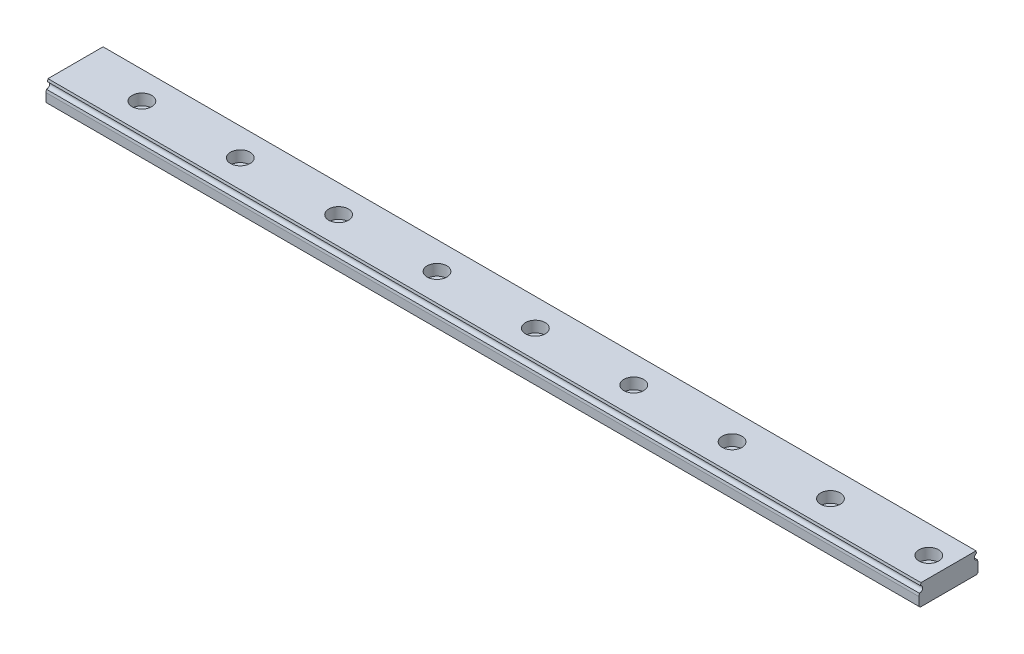
ISO-10303-21;
HEADER;
FILE_DESCRIPTION(('STEP AP214'),'2;1');
FILE_NAME('part.step','',(''),(''),'','','');
FILE_SCHEMA(('AUTOMOTIVE_DESIGN { 1 0 10303 214 1 1 1 1 }'));
ENDSEC;
DATA;
#1=APPLICATION_CONTEXT('core data for automotive mechanical design processes');
#2=APPLICATION_PROTOCOL_DEFINITION('international standard','automotive_design',2000,#1);
#3=PRODUCT_CONTEXT('',#1,'mechanical');
#4=PRODUCT('Part','Part','',(#3));
#5=PRODUCT_RELATED_PRODUCT_CATEGORY('part','',(#4));
#6=PRODUCT_DEFINITION_FORMATION('','',#4);
#7=PRODUCT_DEFINITION_CONTEXT('part definition',#1,'design');
#8=PRODUCT_DEFINITION('design','',#6,#7);
#9=PRODUCT_DEFINITION_SHAPE('','',#8);
#10=(LENGTH_UNIT() NAMED_UNIT(*) SI_UNIT(.MILLI.,.METRE.));
#11=(NAMED_UNIT(*) PLANE_ANGLE_UNIT() SI_UNIT($,.RADIAN.));
#12=(NAMED_UNIT(*) SI_UNIT($,.STERADIAN.) SOLID_ANGLE_UNIT());
#13=UNCERTAINTY_MEASURE_WITH_UNIT(LENGTH_MEASURE(1.E-05),#10,'distance_accuracy_value','');
#14=(GEOMETRIC_REPRESENTATION_CONTEXT(3) GLOBAL_UNCERTAINTY_ASSIGNED_CONTEXT((#13)) GLOBAL_UNIT_ASSIGNED_CONTEXT((#10,
#11,#12)) REPRESENTATION_CONTEXT('',''));
#15=CARTESIAN_POINT('',(0.,0.,0.));
#16=DIRECTION('',(0.,0.,1.));
#17=DIRECTION('',(1.,0.,0.));
#18=AXIS2_PLACEMENT_3D('',#15,#16,#17);
#19=CARTESIAN_POINT('',(-107.,8.5,-11.206528586812));
#20=DIRECTION('',(0.,1.,0.));
#21=DIRECTION('',(0.,0.,1.));
#22=AXIS2_PLACEMENT_3D('',#19,#20,#21);
#23=PLANE('',#22);
#24=CARTESIAN_POINT('',(200.,8.5,0.));
#25=DIRECTION('',(0.,1.,0.));
#26=DIRECTION('',(0.,0.,1.));
#27=AXIS2_PLACEMENT_3D('',#24,#25,#26);
#28=CIRCLE('',#27,4.);
#29=CARTESIAN_POINT('',(200.,8.5,4.));
#30=VERTEX_POINT('',#29);
#31=EDGE_CURVE('E434',#30,#30,#28,.T.);
#32=ORIENTED_EDGE('',*,*,#31,.F.);
#33=EDGE_LOOP('',(#32));
#34=FACE_BOUND('',#33,.T.);
#35=CARTESIAN_POINT('',(120.,8.5,0.));
#36=DIRECTION('',(0.,1.,0.));
#37=DIRECTION('',(0.,0.,1.));
#38=AXIS2_PLACEMENT_3D('',#35,#36,#37);
#39=CIRCLE('',#38,4.);
#40=CARTESIAN_POINT('',(120.,8.5,4.));
#41=VERTEX_POINT('',#40);
#42=EDGE_CURVE('E458',#41,#41,#39,.T.);
#43=ORIENTED_EDGE('',*,*,#42,.F.);
#44=EDGE_LOOP('',(#43));
#45=FACE_BOUND('',#44,.T.);
#46=CARTESIAN_POINT('',(-80.,8.5,0.));
#47=DIRECTION('',(0.,1.,0.));
#48=DIRECTION('',(0.,0.,1.));
#49=AXIS2_PLACEMENT_3D('',#46,#47,#48);
#50=CIRCLE('',#49,4.);
#51=CARTESIAN_POINT('',(-80.,8.5,4.));
#52=VERTEX_POINT('',#51);
#53=EDGE_CURVE('E482',#52,#52,#50,.T.);
#54=ORIENTED_EDGE('',*,*,#53,.F.);
#55=EDGE_LOOP('',(#54));
#56=FACE_BOUND('',#55,.T.);
#57=CARTESIAN_POINT('',(0.,8.5,0.));
#58=DIRECTION('',(0.,1.,0.));
#59=DIRECTION('',(0.,0.,1.));
#60=AXIS2_PLACEMENT_3D('',#57,#58,#59);
#61=CIRCLE('',#60,4.);
#62=CARTESIAN_POINT('',(0.,8.5,4.));
#63=VERTEX_POINT('',#62);
#64=EDGE_CURVE('E506',#63,#63,#61,.T.);
#65=ORIENTED_EDGE('',*,*,#64,.F.);
#66=EDGE_LOOP('',(#65));
#67=FACE_BOUND('',#66,.T.);
#68=DIRECTION('',(1.,0.,0.));
#69=VECTOR('',#68,1.);
#70=CARTESIAN_POINT('',(-107.,8.5,11.206528586812));
#71=LINE('',#70,#69);
#72=CARTESIAN_POINT('',(-107.,8.5,11.206528586812));
#73=VERTEX_POINT('',#72);
#74=CARTESIAN_POINT('',(248.,8.5,11.206528586812));
#75=VERTEX_POINT('',#74);
#76=EDGE_CURVE('E205',#73,#75,#71,.T.);
#77=ORIENTED_EDGE('',*,*,#76,.T.);
#78=DIRECTION('',(0.,0.,1.));
#79=VECTOR('',#78,1.);
#80=CARTESIAN_POINT('',(248.,8.5,-11.206528586812));
#81=LINE('',#80,#79);
#82=CARTESIAN_POINT('',(248.,8.5,-11.206528586812));
#83=VERTEX_POINT('',#82);
#84=EDGE_CURVE('E168',#83,#75,#81,.T.);
#85=ORIENTED_EDGE('',*,*,#84,.F.);
#86=DIRECTION('',(1.,0.,0.));
#87=VECTOR('',#86,1.);
#88=CARTESIAN_POINT('',(-107.,8.5,-11.206528586812));
#89=LINE('',#88,#87);
#90=CARTESIAN_POINT('',(-107.,8.5,-11.206528586812));
#91=VERTEX_POINT('',#90);
#92=EDGE_CURVE('E207',#91,#83,#89,.T.);
#93=ORIENTED_EDGE('',*,*,#92,.F.);
#94=DIRECTION('',(0.,0.,1.));
#95=VECTOR('',#94,1.);
#96=CARTESIAN_POINT('',(-107.,8.5,-11.206528586812));
#97=LINE('',#96,#95);
#98=EDGE_CURVE('E198',#91,#73,#97,.T.);
#99=ORIENTED_EDGE('',*,*,#98,.T.);
#100=EDGE_LOOP('',(#77,#85,#93,#99));
#101=FACE_BOUND('',#100,.T.);
#102=CARTESIAN_POINT('',(40.,8.5,0.));
#103=DIRECTION('',(0.,1.,0.));
#104=DIRECTION('',(0.,0.,1.));
#105=AXIS2_PLACEMENT_3D('',#102,#103,#104);
#106=CIRCLE('',#105,4.);
#107=CARTESIAN_POINT('',(40.,8.5,4.));
#108=VERTEX_POINT('',#107);
#109=EDGE_CURVE('E142',#108,#108,#106,.T.);
#110=ORIENTED_EDGE('',*,*,#109,.F.);
#111=EDGE_LOOP('',(#110));
#112=FACE_BOUND('',#111,.T.);
#113=CARTESIAN_POINT('',(-40.,8.5,0.));
#114=DIRECTION('',(0.,1.,0.));
#115=DIRECTION('',(0.,0.,1.));
#116=AXIS2_PLACEMENT_3D('',#113,#114,#115);
#117=CIRCLE('',#116,4.);
#118=CARTESIAN_POINT('',(-40.,8.5,4.));
#119=VERTEX_POINT('',#118);
#120=EDGE_CURVE('E494',#119,#119,#117,.T.);
#121=ORIENTED_EDGE('',*,*,#120,.F.);
#122=EDGE_LOOP('',(#121));
#123=FACE_BOUND('',#122,.T.);
#124=CARTESIAN_POINT('',(80.,8.5,0.));
#125=DIRECTION('',(0.,1.,0.));
#126=DIRECTION('',(0.,0.,1.));
#127=AXIS2_PLACEMENT_3D('',#124,#125,#126);
#128=CIRCLE('',#127,4.);
#129=CARTESIAN_POINT('',(80.,8.5,4.));
#130=VERTEX_POINT('',#129);
#131=EDGE_CURVE('E470',#130,#130,#128,.T.);
#132=ORIENTED_EDGE('',*,*,#131,.F.);
#133=EDGE_LOOP('',(#132));
#134=FACE_BOUND('',#133,.T.);
#135=CARTESIAN_POINT('',(160.,8.5,0.));
#136=DIRECTION('',(0.,1.,0.));
#137=DIRECTION('',(0.,0.,1.));
#138=AXIS2_PLACEMENT_3D('',#135,#136,#137);
#139=CIRCLE('',#138,4.);
#140=CARTESIAN_POINT('',(160.,8.5,4.));
#141=VERTEX_POINT('',#140);
#142=EDGE_CURVE('E446',#141,#141,#139,.T.);
#143=ORIENTED_EDGE('',*,*,#142,.F.);
#144=EDGE_LOOP('',(#143));
#145=FACE_BOUND('',#144,.T.);
#146=CARTESIAN_POINT('',(240.,8.5,0.));
#147=DIRECTION('',(0.,1.,0.));
#148=DIRECTION('',(0.,0.,1.));
#149=AXIS2_PLACEMENT_3D('',#146,#147,#148);
#150=CIRCLE('',#149,4.);
#151=CARTESIAN_POINT('',(240.,8.5,4.));
#152=VERTEX_POINT('',#151);
#153=EDGE_CURVE('E422',#152,#152,#150,.T.);
#154=ORIENTED_EDGE('',*,*,#153,.F.);
#155=EDGE_LOOP('',(#154));
#156=FACE_BOUND('',#155,.T.);
#157=ADVANCED_FACE('F34',(#34,#45,#56,#67,#101,#112,#123,#134,#145,#156),#23,.T.);
#158=CARTESIAN_POINT('',(-107.,0.,11.5));
#159=DIRECTION('',(0.,-1.,0.));
#160=DIRECTION('',(0.,0.,-1.));
#161=AXIS2_PLACEMENT_3D('',#158,#159,#160);
#162=PLANE('',#161);
#163=CARTESIAN_POINT('',(200.,0.,0.));
#164=DIRECTION('',(0.,1.,0.));
#165=DIRECTION('',(0.,0.,1.));
#166=AXIS2_PLACEMENT_3D('',#163,#164,#165);
#167=CIRCLE('',#166,2.25);
#168=CARTESIAN_POINT('',(200.,0.,2.25));
#169=VERTEX_POINT('',#168);
#170=EDGE_CURVE('E425',#169,#169,#167,.T.);
#171=ORIENTED_EDGE('',*,*,#170,.T.);
#172=EDGE_LOOP('',(#171));
#173=FACE_BOUND('',#172,.T.);
#174=CARTESIAN_POINT('',(120.,0.,0.));
#175=DIRECTION('',(0.,1.,0.));
#176=DIRECTION('',(0.,0.,1.));
#177=AXIS2_PLACEMENT_3D('',#174,#175,#176);
#178=CIRCLE('',#177,2.25);
#179=CARTESIAN_POINT('',(120.,0.,2.25));
#180=VERTEX_POINT('',#179);
#181=EDGE_CURVE('E449',#180,#180,#178,.T.);
#182=ORIENTED_EDGE('',*,*,#181,.T.);
#183=EDGE_LOOP('',(#182));
#184=FACE_BOUND('',#183,.T.);
#185=CARTESIAN_POINT('',(-80.,0.,0.));
#186=DIRECTION('',(0.,1.,0.));
#187=DIRECTION('',(0.,0.,1.));
#188=AXIS2_PLACEMENT_3D('',#185,#186,#187);
#189=CIRCLE('',#188,2.25);
#190=CARTESIAN_POINT('',(-80.,0.,2.25));
#191=VERTEX_POINT('',#190);
#192=EDGE_CURVE('E473',#191,#191,#189,.T.);
#193=ORIENTED_EDGE('',*,*,#192,.T.);
#194=EDGE_LOOP('',(#193));
#195=FACE_BOUND('',#194,.T.);
#196=CARTESIAN_POINT('',(0.,0.,0.));
#197=DIRECTION('',(0.,1.,0.));
#198=DIRECTION('',(0.,0.,1.));
#199=AXIS2_PLACEMENT_3D('',#196,#197,#198);
#200=CIRCLE('',#199,2.25);
#201=CARTESIAN_POINT('',(0.,0.,2.25));
#202=VERTEX_POINT('',#201);
#203=EDGE_CURVE('E497',#202,#202,#200,.T.);
#204=ORIENTED_EDGE('',*,*,#203,.T.);
#205=EDGE_LOOP('',(#204));
#206=FACE_BOUND('',#205,.T.);
#207=DIRECTION('',(1.,0.,0.));
#208=VECTOR('',#207,1.);
#209=CARTESIAN_POINT('',(-107.,0.,-11.5));
#210=LINE('',#209,#208);
#211=CARTESIAN_POINT('',(-107.,0.,-11.5));
#212=VERTEX_POINT('',#211);
#213=CARTESIAN_POINT('',(248.,0.,-11.5));
#214=VERTEX_POINT('',#213);
#215=EDGE_CURVE('E217',#212,#214,#210,.T.);
#216=ORIENTED_EDGE('',*,*,#215,.T.);
#217=DIRECTION('',(0.,0.,-1.));
#218=VECTOR('',#217,1.);
#219=CARTESIAN_POINT('',(248.,0.,11.5));
#220=LINE('',#219,#218);
#221=CARTESIAN_POINT('',(248.,0.,11.5));
#222=VERTEX_POINT('',#221);
#223=EDGE_CURVE('E150',#222,#214,#220,.T.);
#224=ORIENTED_EDGE('',*,*,#223,.F.);
#225=DIRECTION('',(1.,0.,0.));
#226=VECTOR('',#225,1.);
#227=CARTESIAN_POINT('',(-107.,0.,11.5));
#228=LINE('',#227,#226);
#229=CARTESIAN_POINT('',(-107.,0.,11.5));
#230=VERTEX_POINT('',#229);
#231=EDGE_CURVE('E219',#230,#222,#228,.T.);
#232=ORIENTED_EDGE('',*,*,#231,.F.);
#233=DIRECTION('',(0.,0.,-1.));
#234=VECTOR('',#233,1.);
#235=CARTESIAN_POINT('',(-107.,0.,11.5));
#236=LINE('',#235,#234);
#237=EDGE_CURVE('E180',#230,#212,#236,.T.);
#238=ORIENTED_EDGE('',*,*,#237,.T.);
#239=EDGE_LOOP('',(#216,#224,#232,#238));
#240=FACE_BOUND('',#239,.T.);
#241=CARTESIAN_POINT('',(40.,0.,0.));
#242=DIRECTION('',(0.,1.,0.));
#243=DIRECTION('',(0.,0.,1.));
#244=AXIS2_PLACEMENT_3D('',#241,#242,#243);
#245=CIRCLE('',#244,2.25);
#246=CARTESIAN_POINT('',(40.,0.,2.25));
#247=VERTEX_POINT('',#246);
#248=EDGE_CURVE('E509',#247,#247,#245,.T.);
#249=ORIENTED_EDGE('',*,*,#248,.T.);
#250=EDGE_LOOP('',(#249));
#251=FACE_BOUND('',#250,.T.);
#252=CARTESIAN_POINT('',(-40.,0.,0.));
#253=DIRECTION('',(0.,1.,0.));
#254=DIRECTION('',(0.,0.,1.));
#255=AXIS2_PLACEMENT_3D('',#252,#253,#254);
#256=CIRCLE('',#255,2.25);
#257=CARTESIAN_POINT('',(-40.,0.,2.25));
#258=VERTEX_POINT('',#257);
#259=EDGE_CURVE('E485',#258,#258,#256,.T.);
#260=ORIENTED_EDGE('',*,*,#259,.T.);
#261=EDGE_LOOP('',(#260));
#262=FACE_BOUND('',#261,.T.);
#263=CARTESIAN_POINT('',(80.,0.,0.));
#264=DIRECTION('',(0.,1.,0.));
#265=DIRECTION('',(0.,0.,1.));
#266=AXIS2_PLACEMENT_3D('',#263,#264,#265);
#267=CIRCLE('',#266,2.25);
#268=CARTESIAN_POINT('',(80.,0.,2.25));
#269=VERTEX_POINT('',#268);
#270=EDGE_CURVE('E461',#269,#269,#267,.T.);
#271=ORIENTED_EDGE('',*,*,#270,.T.);
#272=EDGE_LOOP('',(#271));
#273=FACE_BOUND('',#272,.T.);
#274=CARTESIAN_POINT('',(160.,0.,0.));
#275=DIRECTION('',(0.,1.,0.));
#276=DIRECTION('',(0.,0.,1.));
#277=AXIS2_PLACEMENT_3D('',#274,#275,#276);
#278=CIRCLE('',#277,2.25);
#279=CARTESIAN_POINT('',(160.,0.,2.25));
#280=VERTEX_POINT('',#279);
#281=EDGE_CURVE('E437',#280,#280,#278,.T.);
#282=ORIENTED_EDGE('',*,*,#281,.T.);
#283=EDGE_LOOP('',(#282));
#284=FACE_BOUND('',#283,.T.);
#285=CARTESIAN_POINT('',(240.,0.,0.));
#286=DIRECTION('',(0.,1.,0.));
#287=DIRECTION('',(0.,0.,1.));
#288=AXIS2_PLACEMENT_3D('',#285,#286,#287);
#289=CIRCLE('',#288,2.25);
#290=CARTESIAN_POINT('',(240.,0.,2.25));
#291=VERTEX_POINT('',#290);
#292=EDGE_CURVE('E414',#291,#291,#289,.T.);
#293=ORIENTED_EDGE('',*,*,#292,.T.);
#294=EDGE_LOOP('',(#293));
#295=FACE_BOUND('',#294,.T.);
#296=ADVANCED_FACE('F227',(#173,#184,#195,#206,#240,#251,#262,#273,#284,#295),#162,.T.);
#297=CARTESIAN_POINT('',(-107.,5.0516684389765,11.814562479449));
#298=DIRECTION('',(0.,0.17364817766683,0.984807753012226));
#299=DIRECTION('',(0.,-0.984807753012226,0.17364817766683));
#300=AXIS2_PLACEMENT_3D('',#297,#298,#299);
#301=PLANE('',#300);
#302=DIRECTION('',(1.,0.,0.));
#303=VECTOR('',#302,1.);
#304=CARTESIAN_POINT('',(-107.,4.,12.));
#305=LINE('',#304,#303);
#306=CARTESIAN_POINT('',(-107.,4.,12.));
#307=VERTEX_POINT('',#306);
#308=CARTESIAN_POINT('',(248.,4.,12.));
#309=VERTEX_POINT('',#308);
#310=EDGE_CURVE('E38',#307,#309,#305,.T.);
#311=ORIENTED_EDGE('',*,*,#310,.T.);
#312=DIRECTION('',(0.,-0.984807753012226,0.17364817766683));
#313=VECTOR('',#312,1.);
#314=CARTESIAN_POINT('',(248.,5.0516684389765,11.814562479449));
#315=LINE('',#314,#313);
#316=CARTESIAN_POINT('',(248.,5.0516684389765,11.814562479449));
#317=VERTEX_POINT('',#316);
#318=EDGE_CURVE('E123',#317,#309,#315,.T.);
#319=ORIENTED_EDGE('',*,*,#318,.F.);
#320=DIRECTION('',(1.,0.,0.));
#321=VECTOR('',#320,1.);
#322=CARTESIAN_POINT('',(-107.,5.0516684389765,11.814562479449));
#323=LINE('',#322,#321);
#324=CARTESIAN_POINT('',(-107.,5.0516684389765,11.814562479449));
#325=VERTEX_POINT('',#324);
#326=EDGE_CURVE('E11',#325,#317,#323,.T.);
#327=ORIENTED_EDGE('',*,*,#326,.F.);
#328=DIRECTION('',(0.,-0.984807753012226,0.17364817766683));
#329=VECTOR('',#328,1.);
#330=CARTESIAN_POINT('',(-107.,5.0516684389765,11.814562479449));
#331=LINE('',#330,#329);
#332=EDGE_CURVE('E124',#325,#307,#331,.T.);
#333=ORIENTED_EDGE('',*,*,#332,.T.);
#334=EDGE_LOOP('',(#311,#319,#327,#333));
#335=FACE_BOUND('',#334,.T.);
#336=ADVANCED_FACE('F36',(#335),#301,.T.);
#337=CARTESIAN_POINT('',(-107.,6.29999999999996,11.7500000000002));
#338=DIRECTION('',(1.,0.,0.));
#339=DIRECTION('',(0.,0.,-1.));
#340=AXIS2_PLACEMENT_3D('',#337,#338,#339);
#341=CYLINDRICAL_SURFACE('',#340,1.24999999999994);
#342=ORIENTED_EDGE('',*,*,#326,.T.);
#343=CARTESIAN_POINT('',(248.,6.29999999999996,11.7500000000002));
#344=DIRECTION('',(-1.,0.,0.));
#345=DIRECTION('',(0.,0.,1.));
#346=AXIS2_PLACEMENT_3D('',#343,#344,#345);
#347=CIRCLE('',#346,1.24999999999994);
#348=CARTESIAN_POINT('',(248.,7.4951296246625,11.383714346099));
#349=VERTEX_POINT('',#348);
#350=EDGE_CURVE('E141',#349,#317,#347,.T.);
#351=ORIENTED_EDGE('',*,*,#350,.F.);
#352=DIRECTION('',(1.,0.,0.));
#353=VECTOR('',#352,1.);
#354=CARTESIAN_POINT('',(-107.,7.4951296246625,11.383714346099));
#355=LINE('',#354,#353);
#356=CARTESIAN_POINT('',(-107.,7.4951296246625,11.383714346099));
#357=VERTEX_POINT('',#356);
#358=EDGE_CURVE('E43',#357,#349,#355,.T.);
#359=ORIENTED_EDGE('',*,*,#358,.F.);
#360=CARTESIAN_POINT('',(-107.,6.29999999999996,11.7500000000002));
#361=DIRECTION('',(-1.,0.,0.));
#362=DIRECTION('',(0.,0.,1.));
#363=AXIS2_PLACEMENT_3D('',#360,#361,#362);
#364=CIRCLE('',#363,1.24999999999994);
#365=EDGE_CURVE('E129',#357,#325,#364,.T.);
#366=ORIENTED_EDGE('',*,*,#365,.T.);
#367=EDGE_LOOP('',(#342,#351,#359,#366));
#368=FACE_BOUND('',#367,.T.);
#369=ADVANCED_FACE('F259',(#368),#341,.F.);
#370=CARTESIAN_POINT('',(-107.,8.5,11.206528586812));
#371=DIRECTION('',(0.,0.173648177667269,0.984807753012148));
#372=DIRECTION('',(0.,-0.984807753012148,0.173648177667269));
#373=AXIS2_PLACEMENT_3D('',#370,#371,#372);
#374=PLANE('',#373);
#375=ORIENTED_EDGE('',*,*,#358,.T.);
#376=DIRECTION('',(0.,-0.984807753012148,0.173648177667269));
#377=VECTOR('',#376,1.);
#378=CARTESIAN_POINT('',(248.,8.5,11.206528586812));
#379=LINE('',#378,#377);
#380=EDGE_CURVE('E171',#75,#349,#379,.T.);
#381=ORIENTED_EDGE('',*,*,#380,.F.);
#382=ORIENTED_EDGE('',*,*,#76,.F.);
#383=DIRECTION('',(0.,-0.984807753012148,0.173648177667269));
#384=VECTOR('',#383,1.);
#385=CARTESIAN_POINT('',(-107.,8.5,11.206528586812));
#386=LINE('',#385,#384);
#387=EDGE_CURVE('E201',#73,#357,#386,.T.);
#388=ORIENTED_EDGE('',*,*,#387,.T.);
#389=EDGE_LOOP('',(#375,#381,#382,#388));
#390=FACE_BOUND('',#389,.T.);
#391=ADVANCED_FACE('F257',(#390),#374,.T.);
#392=CARTESIAN_POINT('',(-107.,7.4951296246625,-11.383714346099));
#393=DIRECTION('',(0.,0.173648177667269,-0.984807753012148));
#394=DIRECTION('',(0.,0.984807753012148,0.173648177667269));
#395=AXIS2_PLACEMENT_3D('',#392,#393,#394);
#396=PLANE('',#395);
#397=ORIENTED_EDGE('',*,*,#92,.T.);
#398=DIRECTION('',(0.,0.984807753012148,0.173648177667269));
#399=VECTOR('',#398,1.);
#400=CARTESIAN_POINT('',(248.,7.4951296246625,-11.383714346099));
#401=LINE('',#400,#399);
#402=CARTESIAN_POINT('',(248.,7.4951296246625,-11.383714346099));
#403=VERTEX_POINT('',#402);
#404=EDGE_CURVE('E165',#403,#83,#401,.T.);
#405=ORIENTED_EDGE('',*,*,#404,.F.);
#406=DIRECTION('',(1.,0.,0.));
#407=VECTOR('',#406,1.);
#408=CARTESIAN_POINT('',(-107.,7.4951296246625,-11.383714346099));
#409=LINE('',#408,#407);
#410=CARTESIAN_POINT('',(-107.,7.4951296246625,-11.383714346099));
#411=VERTEX_POINT('',#410);
#412=EDGE_CURVE('E209',#411,#403,#409,.T.);
#413=ORIENTED_EDGE('',*,*,#412,.F.);
#414=DIRECTION('',(0.,0.984807753012148,0.173648177667269));
#415=VECTOR('',#414,1.);
#416=CARTESIAN_POINT('',(-107.,7.4951296246625,-11.383714346099));
#417=LINE('',#416,#415);
#418=EDGE_CURVE('E195',#411,#91,#417,.T.);
#419=ORIENTED_EDGE('',*,*,#418,.T.);
#420=EDGE_LOOP('',(#397,#405,#413,#419));
#421=FACE_BOUND('',#420,.T.);
#422=ADVANCED_FACE('F250',(#421),#396,.T.);
#423=CARTESIAN_POINT('',(-107.,6.29999999999996,-11.7500000000002));
#424=DIRECTION('',(1.,0.,0.));
#425=DIRECTION('',(0.,0.,-1.));
#426=AXIS2_PLACEMENT_3D('',#423,#424,#425);
#427=CYLINDRICAL_SURFACE('',#426,1.24999999999994);
#428=ORIENTED_EDGE('',*,*,#412,.T.);
#429=CARTESIAN_POINT('',(248.,6.29999999999996,-11.7500000000002));
#430=DIRECTION('',(-1.,0.,0.));
#431=DIRECTION('',(0.,0.,1.));
#432=AXIS2_PLACEMENT_3D('',#429,#430,#431);
#433=CIRCLE('',#432,1.24999999999994);
#434=CARTESIAN_POINT('',(248.,5.0516684389765,-11.814562479449));
#435=VERTEX_POINT('',#434);
#436=EDGE_CURVE('E162',#435,#403,#433,.T.);
#437=ORIENTED_EDGE('',*,*,#436,.F.);
#438=DIRECTION('',(1.,0.,0.));
#439=VECTOR('',#438,1.);
#440=CARTESIAN_POINT('',(-107.,5.0516684389765,-11.814562479449));
#441=LINE('',#440,#439);
#442=CARTESIAN_POINT('',(-107.,5.0516684389765,-11.814562479449));
#443=VERTEX_POINT('',#442);
#444=EDGE_CURVE('E211',#443,#435,#441,.T.);
#445=ORIENTED_EDGE('',*,*,#444,.F.);
#446=CARTESIAN_POINT('',(-107.,6.29999999999996,-11.7500000000002));
#447=DIRECTION('',(-1.,0.,0.));
#448=DIRECTION('',(0.,0.,1.));
#449=AXIS2_PLACEMENT_3D('',#446,#447,#448);
#450=CIRCLE('',#449,1.24999999999994);
#451=EDGE_CURVE('E192',#443,#411,#450,.T.);
#452=ORIENTED_EDGE('',*,*,#451,.T.);
#453=EDGE_LOOP('',(#428,#437,#445,#452));
#454=FACE_BOUND('',#453,.T.);
#455=ADVANCED_FACE('F245',(#454),#427,.F.);
#456=CARTESIAN_POINT('',(-107.,4.,-12.));
#457=DIRECTION('',(0.,0.17364817766683,-0.984807753012226));
#458=DIRECTION('',(0.,0.984807753012226,0.17364817766683));
#459=AXIS2_PLACEMENT_3D('',#456,#457,#458);
#460=PLANE('',#459);
#461=ORIENTED_EDGE('',*,*,#444,.T.);
#462=DIRECTION('',(0.,0.984807753012226,0.17364817766683));
#463=VECTOR('',#462,1.);
#464=CARTESIAN_POINT('',(248.,4.,-12.));
#465=LINE('',#464,#463);
#466=CARTESIAN_POINT('',(248.,4.,-12.));
#467=VERTEX_POINT('',#466);
#468=EDGE_CURVE('E159',#467,#435,#465,.T.);
#469=ORIENTED_EDGE('',*,*,#468,.F.);
#470=DIRECTION('',(1.,0.,0.));
#471=VECTOR('',#470,1.);
#472=CARTESIAN_POINT('',(-107.,4.,-12.));
#473=LINE('',#472,#471);
#474=CARTESIAN_POINT('',(-107.,4.,-12.));
#475=VERTEX_POINT('',#474);
#476=EDGE_CURVE('E213',#475,#467,#473,.T.);
#477=ORIENTED_EDGE('',*,*,#476,.F.);
#478=DIRECTION('',(0.,0.984807753012226,0.17364817766683));
#479=VECTOR('',#478,1.);
#480=CARTESIAN_POINT('',(-107.,4.,-12.));
#481=LINE('',#480,#479);
#482=EDGE_CURVE('E189',#475,#443,#481,.T.);
#483=ORIENTED_EDGE('',*,*,#482,.T.);
#484=EDGE_LOOP('',(#461,#469,#477,#483));
#485=FACE_BOUND('',#484,.T.);
#486=ADVANCED_FACE('F243',(#485),#460,.T.);
#487=CARTESIAN_POINT('',(-107.,0.5,-12.));
#488=DIRECTION('',(0.,0.,-1.));
#489=DIRECTION('',(-1.,0.,0.));
#490=AXIS2_PLACEMENT_3D('',#487,#488,#489);
#491=PLANE('',#490);
#492=ORIENTED_EDGE('',*,*,#476,.T.);
#493=DIRECTION('',(0.,1.,0.));
#494=VECTOR('',#493,1.);
#495=CARTESIAN_POINT('',(248.,0.5,-12.));
#496=LINE('',#495,#494);
#497=CARTESIAN_POINT('',(248.,0.5,-12.));
#498=VERTEX_POINT('',#497);
#499=EDGE_CURVE('E156',#498,#467,#496,.T.);
#500=ORIENTED_EDGE('',*,*,#499,.F.);
#501=DIRECTION('',(1.,0.,0.));
#502=VECTOR('',#501,1.);
#503=CARTESIAN_POINT('',(-107.,0.5,-12.));
#504=LINE('',#503,#502);
#505=CARTESIAN_POINT('',(-107.,0.5,-12.));
#506=VERTEX_POINT('',#505);
#507=EDGE_CURVE('E215',#506,#498,#504,.T.);
#508=ORIENTED_EDGE('',*,*,#507,.F.);
#509=DIRECTION('',(0.,1.,0.));
#510=VECTOR('',#509,1.);
#511=CARTESIAN_POINT('',(-107.,0.5,-12.));
#512=LINE('',#511,#510);
#513=EDGE_CURVE('E186',#506,#475,#512,.T.);
#514=ORIENTED_EDGE('',*,*,#513,.T.);
#515=EDGE_LOOP('',(#492,#500,#508,#514));
#516=FACE_BOUND('',#515,.T.);
#517=ADVANCED_FACE('F238',(#516),#491,.T.);
#518=CARTESIAN_POINT('',(-107.,0.,-11.5));
#519=DIRECTION('',(0.,-0.707106781186548,-0.707106781186547));
#520=DIRECTION('',(0.,0.707106781186547,-0.707106781186548));
#521=AXIS2_PLACEMENT_3D('',#518,#519,#520);
#522=PLANE('',#521);
#523=ORIENTED_EDGE('',*,*,#507,.T.);
#524=DIRECTION('',(0.,0.707106781186547,-0.707106781186548));
#525=VECTOR('',#524,1.);
#526=CARTESIAN_POINT('',(248.,0.,-11.5));
#527=LINE('',#526,#525);
#528=EDGE_CURVE('E153',#214,#498,#527,.T.);
#529=ORIENTED_EDGE('',*,*,#528,.F.);
#530=ORIENTED_EDGE('',*,*,#215,.F.);
#531=DIRECTION('',(0.,0.707106781186547,-0.707106781186548));
#532=VECTOR('',#531,1.);
#533=CARTESIAN_POINT('',(-107.,0.,-11.5));
#534=LINE('',#533,#532);
#535=EDGE_CURVE('E183',#212,#506,#534,.T.);
#536=ORIENTED_EDGE('',*,*,#535,.T.);
#537=EDGE_LOOP('',(#523,#529,#530,#536));
#538=FACE_BOUND('',#537,.T.);
#539=ADVANCED_FACE('F231',(#538),#522,.T.);
#540=CARTESIAN_POINT('',(-107.,0.5,12.));
#541=DIRECTION('',(0.,-0.707106781186548,0.707106781186547));
#542=DIRECTION('',(0.,-0.707106781186547,-0.707106781186548));
#543=AXIS2_PLACEMENT_3D('',#540,#541,#542);
#544=PLANE('',#543);
#545=ORIENTED_EDGE('',*,*,#231,.T.);
#546=DIRECTION('',(0.,-0.707106781186547,-0.707106781186548));
#547=VECTOR('',#546,1.);
#548=CARTESIAN_POINT('',(248.,0.5,12.));
#549=LINE('',#548,#547);
#550=CARTESIAN_POINT('',(248.,0.5,12.));
#551=VERTEX_POINT('',#550);
#552=EDGE_CURVE('E136',#551,#222,#549,.T.);
#553=ORIENTED_EDGE('',*,*,#552,.F.);
#554=DIRECTION('',(1.,0.,0.));
#555=VECTOR('',#554,1.);
#556=CARTESIAN_POINT('',(-107.,0.5,12.));
#557=LINE('',#556,#555);
#558=CARTESIAN_POINT('',(-107.,0.5,12.));
#559=VERTEX_POINT('',#558);
#560=EDGE_CURVE('E128',#559,#551,#557,.T.);
#561=ORIENTED_EDGE('',*,*,#560,.F.);
#562=DIRECTION('',(0.,-0.707106781186547,-0.707106781186548));
#563=VECTOR('',#562,1.);
#564=CARTESIAN_POINT('',(-107.,0.5,12.));
#565=LINE('',#564,#563);
#566=EDGE_CURVE('E177',#559,#230,#565,.T.);
#567=ORIENTED_EDGE('',*,*,#566,.T.);
#568=EDGE_LOOP('',(#545,#553,#561,#567));
#569=FACE_BOUND('',#568,.T.);
#570=ADVANCED_FACE('F221',(#569),#544,.T.);
#571=CARTESIAN_POINT('',(-107.,4.,12.));
#572=DIRECTION('',(0.,0.,1.));
#573=DIRECTION('',(1.,0.,0.));
#574=AXIS2_PLACEMENT_3D('',#571,#572,#573);
#575=PLANE('',#574);
#576=ORIENTED_EDGE('',*,*,#560,.T.);
#577=DIRECTION('',(0.,-1.,0.));
#578=VECTOR('',#577,1.);
#579=CARTESIAN_POINT('',(248.,4.,12.));
#580=LINE('',#579,#578);
#581=EDGE_CURVE('E131',#309,#551,#580,.T.);
#582=ORIENTED_EDGE('',*,*,#581,.F.);
#583=ORIENTED_EDGE('',*,*,#310,.F.);
#584=DIRECTION('',(0.,-1.,0.));
#585=VECTOR('',#584,1.);
#586=CARTESIAN_POINT('',(-107.,4.,12.));
#587=LINE('',#586,#585);
#588=EDGE_CURVE('E175',#307,#559,#587,.T.);
#589=ORIENTED_EDGE('',*,*,#588,.T.);
#590=EDGE_LOOP('',(#576,#582,#583,#589));
#591=FACE_BOUND('',#590,.T.);
#592=ADVANCED_FACE('F132',(#591),#575,.T.);
#593=CARTESIAN_POINT('',(-107.,6.29999999999996,-11.7500000000002));
#594=DIRECTION('',(-1.,0.,0.));
#595=DIRECTION('',(0.,0.,1.));
#596=AXIS2_PLACEMENT_3D('',#593,#594,#595);
#597=PLANE('',#596);
#598=ORIENTED_EDGE('',*,*,#332,.F.);
#599=ORIENTED_EDGE('',*,*,#365,.F.);
#600=ORIENTED_EDGE('',*,*,#387,.F.);
#601=ORIENTED_EDGE('',*,*,#98,.F.);
#602=ORIENTED_EDGE('',*,*,#418,.F.);
#603=ORIENTED_EDGE('',*,*,#451,.F.);
#604=ORIENTED_EDGE('',*,*,#482,.F.);
#605=ORIENTED_EDGE('',*,*,#513,.F.);
#606=ORIENTED_EDGE('',*,*,#535,.F.);
#607=ORIENTED_EDGE('',*,*,#237,.F.);
#608=ORIENTED_EDGE('',*,*,#566,.F.);
#609=ORIENTED_EDGE('',*,*,#588,.F.);
#610=EDGE_LOOP('',(#598,#599,#600,#601,#602,#603,#604,#605,#606,#607,#608,#609));
#611=FACE_BOUND('',#610,.T.);
#612=ADVANCED_FACE('F234',(#611),#597,.T.);
#613=CARTESIAN_POINT('',(248.,6.29999999999996,-11.7500000000002));
#614=DIRECTION('',(-1.,0.,0.));
#615=DIRECTION('',(0.,0.,1.));
#616=AXIS2_PLACEMENT_3D('',#613,#614,#615);
#617=PLANE('',#616);
#618=ORIENTED_EDGE('',*,*,#318,.T.);
#619=ORIENTED_EDGE('',*,*,#581,.T.);
#620=ORIENTED_EDGE('',*,*,#552,.T.);
#621=ORIENTED_EDGE('',*,*,#223,.T.);
#622=ORIENTED_EDGE('',*,*,#528,.T.);
#623=ORIENTED_EDGE('',*,*,#499,.T.);
#624=ORIENTED_EDGE('',*,*,#468,.T.);
#625=ORIENTED_EDGE('',*,*,#436,.T.);
#626=ORIENTED_EDGE('',*,*,#404,.T.);
#627=ORIENTED_EDGE('',*,*,#84,.T.);
#628=ORIENTED_EDGE('',*,*,#380,.T.);
#629=ORIENTED_EDGE('',*,*,#350,.T.);
#630=EDGE_LOOP('',(#618,#619,#620,#621,#622,#623,#624,#625,#626,#627,#628,#629));
#631=FACE_BOUND('',#630,.T.);
#632=ADVANCED_FACE('F139',(#631),#617,.F.);
#633=CARTESIAN_POINT('',(40.,0.,0.));
#634=DIRECTION('',(0.,1.,0.));
#635=DIRECTION('',(0.,0.,1.));
#636=AXIS2_PLACEMENT_3D('',#633,#634,#635);
#637=CYLINDRICAL_SURFACE('',#636,4.);
#638=ORIENTED_EDGE('',*,*,#109,.T.);
#639=EDGE_LOOP('',(#638));
#640=FACE_BOUND('',#639,.T.);
#641=CARTESIAN_POINT('',(40.,4.,0.));
#642=DIRECTION('',(0.,1.,0.));
#643=DIRECTION('',(0.,0.,1.));
#644=AXIS2_PLACEMENT_3D('',#641,#642,#643);
#645=CIRCLE('',#644,4.);
#646=CARTESIAN_POINT('',(40.,4.,4.));
#647=VERTEX_POINT('',#646);
#648=EDGE_CURVE('E145',#647,#647,#645,.T.);
#649=ORIENTED_EDGE('',*,*,#648,.F.);
#650=EDGE_LOOP('',(#649));
#651=FACE_BOUND('',#650,.T.);
#652=ADVANCED_FACE('F297',(#640,#651),#637,.F.);
#653=CARTESIAN_POINT('',(44.,4.,0.));
#654=DIRECTION('',(0.,1.,0.));
#655=DIRECTION('',(0.,0.,1.));
#656=AXIS2_PLACEMENT_3D('',#653,#654,#655);
#657=PLANE('',#656);
#658=ORIENTED_EDGE('',*,*,#648,.T.);
#659=EDGE_LOOP('',(#658));
#660=FACE_BOUND('',#659,.T.);
#661=CARTESIAN_POINT('',(40.,4.,0.));
#662=DIRECTION('',(0.,1.,0.));
#663=DIRECTION('',(0.,0.,1.));
#664=AXIS2_PLACEMENT_3D('',#661,#662,#663);
#665=CIRCLE('',#664,2.25);
#666=CARTESIAN_POINT('',(40.,4.,2.25));
#667=VERTEX_POINT('',#666);
#668=EDGE_CURVE('E512',#667,#667,#665,.T.);
#669=ORIENTED_EDGE('',*,*,#668,.F.);
#670=EDGE_LOOP('',(#669));
#671=FACE_BOUND('',#670,.T.);
#672=ADVANCED_FACE('F302',(#660,#671),#657,.T.);
#673=CARTESIAN_POINT('',(40.,0.,0.));
#674=DIRECTION('',(0.,1.,0.));
#675=DIRECTION('',(0.,0.,1.));
#676=AXIS2_PLACEMENT_3D('',#673,#674,#675);
#677=CYLINDRICAL_SURFACE('',#676,2.25);
#678=ORIENTED_EDGE('',*,*,#668,.T.);
#679=EDGE_LOOP('',(#678));
#680=FACE_BOUND('',#679,.T.);
#681=ORIENTED_EDGE('',*,*,#248,.F.);
#682=EDGE_LOOP('',(#681));
#683=FACE_BOUND('',#682,.T.);
#684=ADVANCED_FACE('F306',(#680,#683),#677,.F.);
#685=CARTESIAN_POINT('',(0.,0.,0.));
#686=DIRECTION('',(0.,1.,0.));
#687=DIRECTION('',(0.,0.,1.));
#688=AXIS2_PLACEMENT_3D('',#685,#686,#687);
#689=CYLINDRICAL_SURFACE('',#688,4.);
#690=ORIENTED_EDGE('',*,*,#64,.T.);
#691=EDGE_LOOP('',(#690));
#692=FACE_BOUND('',#691,.T.);
#693=CARTESIAN_POINT('',(0.,4.,0.));
#694=DIRECTION('',(0.,1.,0.));
#695=DIRECTION('',(0.,0.,1.));
#696=AXIS2_PLACEMENT_3D('',#693,#694,#695);
#697=CIRCLE('',#696,4.);
#698=CARTESIAN_POINT('',(0.,4.,4.));
#699=VERTEX_POINT('',#698);
#700=EDGE_CURVE('E503',#699,#699,#697,.T.);
#701=ORIENTED_EDGE('',*,*,#700,.F.);
#702=EDGE_LOOP('',(#701));
#703=FACE_BOUND('',#702,.T.);
#704=ADVANCED_FACE('F310',(#692,#703),#689,.F.);
#705=CARTESIAN_POINT('',(4.,4.,0.));
#706=DIRECTION('',(0.,1.,0.));
#707=DIRECTION('',(0.,0.,1.));
#708=AXIS2_PLACEMENT_3D('',#705,#706,#707);
#709=PLANE('',#708);
#710=ORIENTED_EDGE('',*,*,#700,.T.);
#711=EDGE_LOOP('',(#710));
#712=FACE_BOUND('',#711,.T.);
#713=CARTESIAN_POINT('',(0.,4.,0.));
#714=DIRECTION('',(0.,1.,0.));
#715=DIRECTION('',(0.,0.,1.));
#716=AXIS2_PLACEMENT_3D('',#713,#714,#715);
#717=CIRCLE('',#716,2.25);
#718=CARTESIAN_POINT('',(0.,4.,2.25));
#719=VERTEX_POINT('',#718);
#720=EDGE_CURVE('E500',#719,#719,#717,.T.);
#721=ORIENTED_EDGE('',*,*,#720,.F.);
#722=EDGE_LOOP('',(#721));
#723=FACE_BOUND('',#722,.T.);
#724=ADVANCED_FACE('F314',(#712,#723),#709,.T.);
#725=CARTESIAN_POINT('',(0.,0.,0.));
#726=DIRECTION('',(0.,1.,0.));
#727=DIRECTION('',(0.,0.,1.));
#728=AXIS2_PLACEMENT_3D('',#725,#726,#727);
#729=CYLINDRICAL_SURFACE('',#728,2.25);
#730=ORIENTED_EDGE('',*,*,#720,.T.);
#731=EDGE_LOOP('',(#730));
#732=FACE_BOUND('',#731,.T.);
#733=ORIENTED_EDGE('',*,*,#203,.F.);
#734=EDGE_LOOP('',(#733));
#735=FACE_BOUND('',#734,.T.);
#736=ADVANCED_FACE('F318',(#732,#735),#729,.F.);
#737=CARTESIAN_POINT('',(-40.,0.,0.));
#738=DIRECTION('',(0.,1.,0.));
#739=DIRECTION('',(0.,0.,1.));
#740=AXIS2_PLACEMENT_3D('',#737,#738,#739);
#741=CYLINDRICAL_SURFACE('',#740,4.);
#742=ORIENTED_EDGE('',*,*,#120,.T.);
#743=EDGE_LOOP('',(#742));
#744=FACE_BOUND('',#743,.T.);
#745=CARTESIAN_POINT('',(-40.,4.,0.));
#746=DIRECTION('',(0.,1.,0.));
#747=DIRECTION('',(0.,0.,1.));
#748=AXIS2_PLACEMENT_3D('',#745,#746,#747);
#749=CIRCLE('',#748,4.);
#750=CARTESIAN_POINT('',(-40.,4.,4.));
#751=VERTEX_POINT('',#750);
#752=EDGE_CURVE('E491',#751,#751,#749,.T.);
#753=ORIENTED_EDGE('',*,*,#752,.F.);
#754=EDGE_LOOP('',(#753));
#755=FACE_BOUND('',#754,.T.);
#756=ADVANCED_FACE('F322',(#744,#755),#741,.F.);
#757=CARTESIAN_POINT('',(-36.,4.,0.));
#758=DIRECTION('',(0.,1.,0.));
#759=DIRECTION('',(0.,0.,1.));
#760=AXIS2_PLACEMENT_3D('',#757,#758,#759);
#761=PLANE('',#760);
#762=ORIENTED_EDGE('',*,*,#752,.T.);
#763=EDGE_LOOP('',(#762));
#764=FACE_BOUND('',#763,.T.);
#765=CARTESIAN_POINT('',(-40.,4.,0.));
#766=DIRECTION('',(0.,1.,0.));
#767=DIRECTION('',(0.,0.,1.));
#768=AXIS2_PLACEMENT_3D('',#765,#766,#767);
#769=CIRCLE('',#768,2.25);
#770=CARTESIAN_POINT('',(-40.,4.,2.25));
#771=VERTEX_POINT('',#770);
#772=EDGE_CURVE('E488',#771,#771,#769,.T.);
#773=ORIENTED_EDGE('',*,*,#772,.F.);
#774=EDGE_LOOP('',(#773));
#775=FACE_BOUND('',#774,.T.);
#776=ADVANCED_FACE('F326',(#764,#775),#761,.T.);
#777=CARTESIAN_POINT('',(-40.,0.,0.));
#778=DIRECTION('',(0.,1.,0.));
#779=DIRECTION('',(0.,0.,1.));
#780=AXIS2_PLACEMENT_3D('',#777,#778,#779);
#781=CYLINDRICAL_SURFACE('',#780,2.25);
#782=ORIENTED_EDGE('',*,*,#772,.T.);
#783=EDGE_LOOP('',(#782));
#784=FACE_BOUND('',#783,.T.);
#785=ORIENTED_EDGE('',*,*,#259,.F.);
#786=EDGE_LOOP('',(#785));
#787=FACE_BOUND('',#786,.T.);
#788=ADVANCED_FACE('F330',(#784,#787),#781,.F.);
#789=CARTESIAN_POINT('',(-80.,0.,0.));
#790=DIRECTION('',(0.,1.,0.));
#791=DIRECTION('',(0.,0.,1.));
#792=AXIS2_PLACEMENT_3D('',#789,#790,#791);
#793=CYLINDRICAL_SURFACE('',#792,4.);
#794=ORIENTED_EDGE('',*,*,#53,.T.);
#795=EDGE_LOOP('',(#794));
#796=FACE_BOUND('',#795,.T.);
#797=CARTESIAN_POINT('',(-80.,4.,0.));
#798=DIRECTION('',(0.,1.,0.));
#799=DIRECTION('',(0.,0.,1.));
#800=AXIS2_PLACEMENT_3D('',#797,#798,#799);
#801=CIRCLE('',#800,4.);
#802=CARTESIAN_POINT('',(-80.,4.,4.));
#803=VERTEX_POINT('',#802);
#804=EDGE_CURVE('E479',#803,#803,#801,.T.);
#805=ORIENTED_EDGE('',*,*,#804,.F.);
#806=EDGE_LOOP('',(#805));
#807=FACE_BOUND('',#806,.T.);
#808=ADVANCED_FACE('F334',(#796,#807),#793,.F.);
#809=CARTESIAN_POINT('',(-76.,4.,0.));
#810=DIRECTION('',(0.,1.,0.));
#811=DIRECTION('',(0.,0.,1.));
#812=AXIS2_PLACEMENT_3D('',#809,#810,#811);
#813=PLANE('',#812);
#814=ORIENTED_EDGE('',*,*,#804,.T.);
#815=EDGE_LOOP('',(#814));
#816=FACE_BOUND('',#815,.T.);
#817=CARTESIAN_POINT('',(-80.,4.,0.));
#818=DIRECTION('',(0.,1.,0.));
#819=DIRECTION('',(0.,0.,1.));
#820=AXIS2_PLACEMENT_3D('',#817,#818,#819);
#821=CIRCLE('',#820,2.25);
#822=CARTESIAN_POINT('',(-80.,4.,2.25));
#823=VERTEX_POINT('',#822);
#824=EDGE_CURVE('E476',#823,#823,#821,.T.);
#825=ORIENTED_EDGE('',*,*,#824,.F.);
#826=EDGE_LOOP('',(#825));
#827=FACE_BOUND('',#826,.T.);
#828=ADVANCED_FACE('F338',(#816,#827),#813,.T.);
#829=CARTESIAN_POINT('',(-80.,0.,0.));
#830=DIRECTION('',(0.,1.,0.));
#831=DIRECTION('',(0.,0.,1.));
#832=AXIS2_PLACEMENT_3D('',#829,#830,#831);
#833=CYLINDRICAL_SURFACE('',#832,2.25);
#834=ORIENTED_EDGE('',*,*,#824,.T.);
#835=EDGE_LOOP('',(#834));
#836=FACE_BOUND('',#835,.T.);
#837=ORIENTED_EDGE('',*,*,#192,.F.);
#838=EDGE_LOOP('',(#837));
#839=FACE_BOUND('',#838,.T.);
#840=ADVANCED_FACE('F342',(#836,#839),#833,.F.);
#841=CARTESIAN_POINT('',(80.,0.,0.));
#842=DIRECTION('',(0.,1.,0.));
#843=DIRECTION('',(0.,0.,1.));
#844=AXIS2_PLACEMENT_3D('',#841,#842,#843);
#845=CYLINDRICAL_SURFACE('',#844,4.);
#846=ORIENTED_EDGE('',*,*,#131,.T.);
#847=EDGE_LOOP('',(#846));
#848=FACE_BOUND('',#847,.T.);
#849=CARTESIAN_POINT('',(80.,4.,0.));
#850=DIRECTION('',(0.,1.,0.));
#851=DIRECTION('',(0.,0.,1.));
#852=AXIS2_PLACEMENT_3D('',#849,#850,#851);
#853=CIRCLE('',#852,4.);
#854=CARTESIAN_POINT('',(80.,4.,4.));
#855=VERTEX_POINT('',#854);
#856=EDGE_CURVE('E467',#855,#855,#853,.T.);
#857=ORIENTED_EDGE('',*,*,#856,.F.);
#858=EDGE_LOOP('',(#857));
#859=FACE_BOUND('',#858,.T.);
#860=ADVANCED_FACE('F346',(#848,#859),#845,.F.);
#861=CARTESIAN_POINT('',(84.,4.,0.));
#862=DIRECTION('',(0.,1.,0.));
#863=DIRECTION('',(0.,0.,1.));
#864=AXIS2_PLACEMENT_3D('',#861,#862,#863);
#865=PLANE('',#864);
#866=ORIENTED_EDGE('',*,*,#856,.T.);
#867=EDGE_LOOP('',(#866));
#868=FACE_BOUND('',#867,.T.);
#869=CARTESIAN_POINT('',(80.,4.,0.));
#870=DIRECTION('',(0.,1.,0.));
#871=DIRECTION('',(0.,0.,1.));
#872=AXIS2_PLACEMENT_3D('',#869,#870,#871);
#873=CIRCLE('',#872,2.25);
#874=CARTESIAN_POINT('',(80.,4.,2.25));
#875=VERTEX_POINT('',#874);
#876=EDGE_CURVE('E464',#875,#875,#873,.T.);
#877=ORIENTED_EDGE('',*,*,#876,.F.);
#878=EDGE_LOOP('',(#877));
#879=FACE_BOUND('',#878,.T.);
#880=ADVANCED_FACE('F350',(#868,#879),#865,.T.);
#881=CARTESIAN_POINT('',(80.,0.,0.));
#882=DIRECTION('',(0.,1.,0.));
#883=DIRECTION('',(0.,0.,1.));
#884=AXIS2_PLACEMENT_3D('',#881,#882,#883);
#885=CYLINDRICAL_SURFACE('',#884,2.25);
#886=ORIENTED_EDGE('',*,*,#876,.T.);
#887=EDGE_LOOP('',(#886));
#888=FACE_BOUND('',#887,.T.);
#889=ORIENTED_EDGE('',*,*,#270,.F.);
#890=EDGE_LOOP('',(#889));
#891=FACE_BOUND('',#890,.T.);
#892=ADVANCED_FACE('F354',(#888,#891),#885,.F.);
#893=CARTESIAN_POINT('',(120.,0.,0.));
#894=DIRECTION('',(0.,1.,0.));
#895=DIRECTION('',(0.,0.,1.));
#896=AXIS2_PLACEMENT_3D('',#893,#894,#895);
#897=CYLINDRICAL_SURFACE('',#896,4.);
#898=ORIENTED_EDGE('',*,*,#42,.T.);
#899=EDGE_LOOP('',(#898));
#900=FACE_BOUND('',#899,.T.);
#901=CARTESIAN_POINT('',(120.,4.,0.));
#902=DIRECTION('',(0.,1.,0.));
#903=DIRECTION('',(0.,0.,1.));
#904=AXIS2_PLACEMENT_3D('',#901,#902,#903);
#905=CIRCLE('',#904,4.);
#906=CARTESIAN_POINT('',(120.,4.,4.));
#907=VERTEX_POINT('',#906);
#908=EDGE_CURVE('E455',#907,#907,#905,.T.);
#909=ORIENTED_EDGE('',*,*,#908,.F.);
#910=EDGE_LOOP('',(#909));
#911=FACE_BOUND('',#910,.T.);
#912=ADVANCED_FACE('F358',(#900,#911),#897,.F.);
#913=CARTESIAN_POINT('',(124.,4.,0.));
#914=DIRECTION('',(0.,1.,0.));
#915=DIRECTION('',(0.,0.,1.));
#916=AXIS2_PLACEMENT_3D('',#913,#914,#915);
#917=PLANE('',#916);
#918=ORIENTED_EDGE('',*,*,#908,.T.);
#919=EDGE_LOOP('',(#918));
#920=FACE_BOUND('',#919,.T.);
#921=CARTESIAN_POINT('',(120.,4.,0.));
#922=DIRECTION('',(0.,1.,0.));
#923=DIRECTION('',(0.,0.,1.));
#924=AXIS2_PLACEMENT_3D('',#921,#922,#923);
#925=CIRCLE('',#924,2.25);
#926=CARTESIAN_POINT('',(120.,4.,2.25));
#927=VERTEX_POINT('',#926);
#928=EDGE_CURVE('E452',#927,#927,#925,.T.);
#929=ORIENTED_EDGE('',*,*,#928,.F.);
#930=EDGE_LOOP('',(#929));
#931=FACE_BOUND('',#930,.T.);
#932=ADVANCED_FACE('F362',(#920,#931),#917,.T.);
#933=CARTESIAN_POINT('',(120.,0.,0.));
#934=DIRECTION('',(0.,1.,0.));
#935=DIRECTION('',(0.,0.,1.));
#936=AXIS2_PLACEMENT_3D('',#933,#934,#935);
#937=CYLINDRICAL_SURFACE('',#936,2.25);
#938=ORIENTED_EDGE('',*,*,#928,.T.);
#939=EDGE_LOOP('',(#938));
#940=FACE_BOUND('',#939,.T.);
#941=ORIENTED_EDGE('',*,*,#181,.F.);
#942=EDGE_LOOP('',(#941));
#943=FACE_BOUND('',#942,.T.);
#944=ADVANCED_FACE('F366',(#940,#943),#937,.F.);
#945=CARTESIAN_POINT('',(160.,0.,0.));
#946=DIRECTION('',(0.,1.,0.));
#947=DIRECTION('',(0.,0.,1.));
#948=AXIS2_PLACEMENT_3D('',#945,#946,#947);
#949=CYLINDRICAL_SURFACE('',#948,4.);
#950=ORIENTED_EDGE('',*,*,#142,.T.);
#951=EDGE_LOOP('',(#950));
#952=FACE_BOUND('',#951,.T.);
#953=CARTESIAN_POINT('',(160.,4.,0.));
#954=DIRECTION('',(0.,1.,0.));
#955=DIRECTION('',(0.,0.,1.));
#956=AXIS2_PLACEMENT_3D('',#953,#954,#955);
#957=CIRCLE('',#956,4.);
#958=CARTESIAN_POINT('',(160.,4.,4.));
#959=VERTEX_POINT('',#958);
#960=EDGE_CURVE('E443',#959,#959,#957,.T.);
#961=ORIENTED_EDGE('',*,*,#960,.F.);
#962=EDGE_LOOP('',(#961));
#963=FACE_BOUND('',#962,.T.);
#964=ADVANCED_FACE('F370',(#952,#963),#949,.F.);
#965=CARTESIAN_POINT('',(164.,4.,0.));
#966=DIRECTION('',(0.,1.,0.));
#967=DIRECTION('',(0.,0.,1.));
#968=AXIS2_PLACEMENT_3D('',#965,#966,#967);
#969=PLANE('',#968);
#970=ORIENTED_EDGE('',*,*,#960,.T.);
#971=EDGE_LOOP('',(#970));
#972=FACE_BOUND('',#971,.T.);
#973=CARTESIAN_POINT('',(160.,4.,0.));
#974=DIRECTION('',(0.,1.,0.));
#975=DIRECTION('',(0.,0.,1.));
#976=AXIS2_PLACEMENT_3D('',#973,#974,#975);
#977=CIRCLE('',#976,2.25);
#978=CARTESIAN_POINT('',(160.,4.,2.25));
#979=VERTEX_POINT('',#978);
#980=EDGE_CURVE('E440',#979,#979,#977,.T.);
#981=ORIENTED_EDGE('',*,*,#980,.F.);
#982=EDGE_LOOP('',(#981));
#983=FACE_BOUND('',#982,.T.);
#984=ADVANCED_FACE('F374',(#972,#983),#969,.T.);
#985=CARTESIAN_POINT('',(160.,0.,0.));
#986=DIRECTION('',(0.,1.,0.));
#987=DIRECTION('',(0.,0.,1.));
#988=AXIS2_PLACEMENT_3D('',#985,#986,#987);
#989=CYLINDRICAL_SURFACE('',#988,2.25);
#990=ORIENTED_EDGE('',*,*,#980,.T.);
#991=EDGE_LOOP('',(#990));
#992=FACE_BOUND('',#991,.T.);
#993=ORIENTED_EDGE('',*,*,#281,.F.);
#994=EDGE_LOOP('',(#993));
#995=FACE_BOUND('',#994,.T.);
#996=ADVANCED_FACE('F378',(#992,#995),#989,.F.);
#997=CARTESIAN_POINT('',(200.,0.,0.));
#998=DIRECTION('',(0.,1.,0.));
#999=DIRECTION('',(0.,0.,1.));
#1000=AXIS2_PLACEMENT_3D('',#997,#998,#999);
#1001=CYLINDRICAL_SURFACE('',#1000,4.);
#1002=ORIENTED_EDGE('',*,*,#31,.T.);
#1003=EDGE_LOOP('',(#1002));
#1004=FACE_BOUND('',#1003,.T.);
#1005=CARTESIAN_POINT('',(200.,4.,0.));
#1006=DIRECTION('',(0.,1.,0.));
#1007=DIRECTION('',(0.,0.,1.));
#1008=AXIS2_PLACEMENT_3D('',#1005,#1006,#1007);
#1009=CIRCLE('',#1008,4.);
#1010=CARTESIAN_POINT('',(200.,4.,4.));
#1011=VERTEX_POINT('',#1010);
#1012=EDGE_CURVE('E431',#1011,#1011,#1009,.T.);
#1013=ORIENTED_EDGE('',*,*,#1012,.F.);
#1014=EDGE_LOOP('',(#1013));
#1015=FACE_BOUND('',#1014,.T.);
#1016=ADVANCED_FACE('F382',(#1004,#1015),#1001,.F.);
#1017=CARTESIAN_POINT('',(204.,4.,0.));
#1018=DIRECTION('',(0.,1.,0.));
#1019=DIRECTION('',(0.,0.,1.));
#1020=AXIS2_PLACEMENT_3D('',#1017,#1018,#1019);
#1021=PLANE('',#1020);
#1022=ORIENTED_EDGE('',*,*,#1012,.T.);
#1023=EDGE_LOOP('',(#1022));
#1024=FACE_BOUND('',#1023,.T.);
#1025=CARTESIAN_POINT('',(200.,4.,0.));
#1026=DIRECTION('',(0.,1.,0.));
#1027=DIRECTION('',(0.,0.,1.));
#1028=AXIS2_PLACEMENT_3D('',#1025,#1026,#1027);
#1029=CIRCLE('',#1028,2.25);
#1030=CARTESIAN_POINT('',(200.,4.,2.25));
#1031=VERTEX_POINT('',#1030);
#1032=EDGE_CURVE('E428',#1031,#1031,#1029,.T.);
#1033=ORIENTED_EDGE('',*,*,#1032,.F.);
#1034=EDGE_LOOP('',(#1033));
#1035=FACE_BOUND('',#1034,.T.);
#1036=ADVANCED_FACE('F386',(#1024,#1035),#1021,.T.);
#1037=CARTESIAN_POINT('',(200.,0.,0.));
#1038=DIRECTION('',(0.,1.,0.));
#1039=DIRECTION('',(0.,0.,1.));
#1040=AXIS2_PLACEMENT_3D('',#1037,#1038,#1039);
#1041=CYLINDRICAL_SURFACE('',#1040,2.25);
#1042=ORIENTED_EDGE('',*,*,#1032,.T.);
#1043=EDGE_LOOP('',(#1042));
#1044=FACE_BOUND('',#1043,.T.);
#1045=ORIENTED_EDGE('',*,*,#170,.F.);
#1046=EDGE_LOOP('',(#1045));
#1047=FACE_BOUND('',#1046,.T.);
#1048=ADVANCED_FACE('F390',(#1044,#1047),#1041,.F.);
#1049=CARTESIAN_POINT('',(240.,0.,0.));
#1050=DIRECTION('',(0.,1.,0.));
#1051=DIRECTION('',(0.,0.,1.));
#1052=AXIS2_PLACEMENT_3D('',#1049,#1050,#1051);
#1053=CYLINDRICAL_SURFACE('',#1052,4.);
#1054=ORIENTED_EDGE('',*,*,#153,.T.);
#1055=EDGE_LOOP('',(#1054));
#1056=FACE_BOUND('',#1055,.T.);
#1057=CARTESIAN_POINT('',(240.,4.,0.));
#1058=DIRECTION('',(0.,1.,0.));
#1059=DIRECTION('',(0.,0.,1.));
#1060=AXIS2_PLACEMENT_3D('',#1057,#1058,#1059);
#1061=CIRCLE('',#1060,4.);
#1062=CARTESIAN_POINT('',(240.,4.,4.));
#1063=VERTEX_POINT('',#1062);
#1064=EDGE_CURVE('E417',#1063,#1063,#1061,.T.);
#1065=ORIENTED_EDGE('',*,*,#1064,.F.);
#1066=EDGE_LOOP('',(#1065));
#1067=FACE_BOUND('',#1066,.T.);
#1068=ADVANCED_FACE('F394',(#1056,#1067),#1053,.F.);
#1069=CARTESIAN_POINT('',(244.,4.,0.));
#1070=DIRECTION('',(0.,1.,0.));
#1071=DIRECTION('',(0.,0.,1.));
#1072=AXIS2_PLACEMENT_3D('',#1069,#1070,#1071);
#1073=PLANE('',#1072);
#1074=ORIENTED_EDGE('',*,*,#1064,.T.);
#1075=EDGE_LOOP('',(#1074));
#1076=FACE_BOUND('',#1075,.T.);
#1077=CARTESIAN_POINT('',(240.,4.,0.));
#1078=DIRECTION('',(0.,1.,0.));
#1079=DIRECTION('',(0.,0.,1.));
#1080=AXIS2_PLACEMENT_3D('',#1077,#1078,#1079);
#1081=CIRCLE('',#1080,2.25);
#1082=CARTESIAN_POINT('',(240.,4.,2.25));
#1083=VERTEX_POINT('',#1082);
#1084=EDGE_CURVE('E411',#1083,#1083,#1081,.T.);
#1085=ORIENTED_EDGE('',*,*,#1084,.F.);
#1086=EDGE_LOOP('',(#1085));
#1087=FACE_BOUND('',#1086,.T.);
#1088=ADVANCED_FACE('F398',(#1076,#1087),#1073,.T.);
#1089=CARTESIAN_POINT('',(240.,0.,0.));
#1090=DIRECTION('',(0.,1.,0.));
#1091=DIRECTION('',(0.,0.,1.));
#1092=AXIS2_PLACEMENT_3D('',#1089,#1090,#1091);
#1093=CYLINDRICAL_SURFACE('',#1092,2.25);
#1094=ORIENTED_EDGE('',*,*,#1084,.T.);
#1095=EDGE_LOOP('',(#1094));
#1096=FACE_BOUND('',#1095,.T.);
#1097=ORIENTED_EDGE('',*,*,#292,.F.);
#1098=EDGE_LOOP('',(#1097));
#1099=FACE_BOUND('',#1098,.T.);
#1100=ADVANCED_FACE('F402',(#1096,#1099),#1093,.F.);
#1101=CLOSED_SHELL('',(#157,#296,#336,#369,#391,#422,#455,#486,#517,#539,#570,#592,#612,#632,
#652,#672,#684,#704,#724,#736,#756,#776,#788,#808,#828,#840,#860,#880,#892,#912,#932,#944,#964,
#984,#996,#1016,#1036,#1048,#1068,#1088,#1100));
#1102=MANIFOLD_SOLID_BREP('B2',#1101);
#1103=ADVANCED_BREP_SHAPE_REPRESENTATION('',(#18,#1102),#14);
#1104=SHAPE_DEFINITION_REPRESENTATION(#9,#1103);
ENDSEC;
END-ISO-10303-21;
